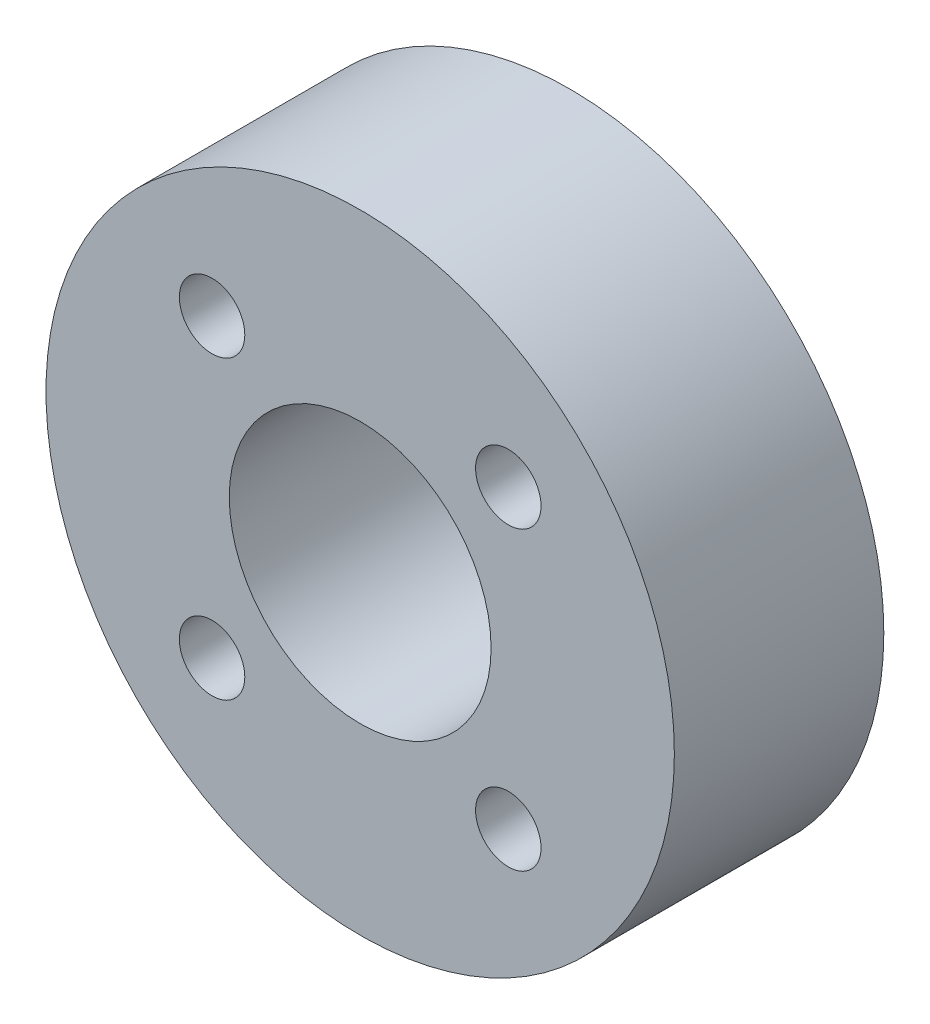
ISO-10303-21;
HEADER;
FILE_DESCRIPTION(('STEP AP214'),'2;1');
FILE_NAME('part.step','',(''),(''),'','','');
FILE_SCHEMA(('AUTOMOTIVE_DESIGN { 1 0 10303 214 1 1 1 1 }'));
ENDSEC;
DATA;
#1=APPLICATION_CONTEXT('core data for automotive mechanical design processes');
#2=APPLICATION_PROTOCOL_DEFINITION('international standard','automotive_design',2000,#1);
#3=PRODUCT_CONTEXT('',#1,'mechanical');
#4=PRODUCT('Part','Part','',(#3));
#5=PRODUCT_RELATED_PRODUCT_CATEGORY('part','',(#4));
#6=PRODUCT_DEFINITION_FORMATION('','',#4);
#7=PRODUCT_DEFINITION_CONTEXT('part definition',#1,'design');
#8=PRODUCT_DEFINITION('design','',#6,#7);
#9=PRODUCT_DEFINITION_SHAPE('','',#8);
#10=(LENGTH_UNIT() NAMED_UNIT(*) SI_UNIT(.MILLI.,.METRE.));
#11=(NAMED_UNIT(*) PLANE_ANGLE_UNIT() SI_UNIT($,.RADIAN.));
#12=(NAMED_UNIT(*) SI_UNIT($,.STERADIAN.) SOLID_ANGLE_UNIT());
#13=UNCERTAINTY_MEASURE_WITH_UNIT(LENGTH_MEASURE(1.E-05),#10,'distance_accuracy_value','');
#14=(GEOMETRIC_REPRESENTATION_CONTEXT(3) GLOBAL_UNCERTAINTY_ASSIGNED_CONTEXT((#13)) GLOBAL_UNIT_ASSIGNED_CONTEXT((#10,
#11,#12)) REPRESENTATION_CONTEXT('',''));
#15=CARTESIAN_POINT('',(0.,0.,0.));
#16=DIRECTION('',(0.,0.,1.));
#17=DIRECTION('',(1.,0.,0.));
#18=AXIS2_PLACEMENT_3D('',#15,#16,#17);
#19=CARTESIAN_POINT('',(0.,0.,8.));
#20=DIRECTION('',(0.,0.,1.));
#21=DIRECTION('',(1.,0.,0.));
#22=AXIS2_PLACEMENT_3D('',#19,#20,#21);
#23=PLANE('',#22);
#24=CARTESIAN_POINT('',(5.65685424949238,-5.65685424949238,8.));
#25=DIRECTION('',(0.,0.,1.));
#26=DIRECTION('',(1.,0.,0.));
#27=AXIS2_PLACEMENT_3D('',#24,#25,#26);
#28=CIRCLE('',#27,1.24999999999999);
#29=CARTESIAN_POINT('',(6.90685424949237,-5.65685424949238,8.));
#30=VERTEX_POINT('',#29);
#31=EDGE_CURVE('E83',#30,#30,#28,.T.);
#32=ORIENTED_EDGE('',*,*,#31,.F.);
#33=EDGE_LOOP('',(#32));
#34=FACE_BOUND('',#33,.T.);
#35=CARTESIAN_POINT('',(-5.65685424949238,-5.65685424949238,8.));
#36=DIRECTION('',(0.,0.,1.));
#37=DIRECTION('',(1.,0.,0.));
#38=AXIS2_PLACEMENT_3D('',#35,#36,#37);
#39=CIRCLE('',#38,1.24999999999999);
#40=CARTESIAN_POINT('',(-4.40685424949239,-5.65685424949238,8.));
#41=VERTEX_POINT('',#40);
#42=EDGE_CURVE('E76',#41,#41,#39,.T.);
#43=ORIENTED_EDGE('',*,*,#42,.F.);
#44=EDGE_LOOP('',(#43));
#45=FACE_BOUND('',#44,.T.);
#46=CARTESIAN_POINT('',(-5.65685424949238,5.65685424949238,8.));
#47=DIRECTION('',(0.,0.,1.));
#48=DIRECTION('',(1.,0.,0.));
#49=AXIS2_PLACEMENT_3D('',#46,#47,#48);
#50=CIRCLE('',#49,1.24999999999999);
#51=CARTESIAN_POINT('',(-4.40685424949239,5.65685424949238,8.));
#52=VERTEX_POINT('',#51);
#53=EDGE_CURVE('E75',#52,#52,#50,.T.);
#54=ORIENTED_EDGE('',*,*,#53,.F.);
#55=EDGE_LOOP('',(#54));
#56=FACE_BOUND('',#55,.T.);
#57=CARTESIAN_POINT('',(5.65685424949238,5.65685424949238,8.));
#58=DIRECTION('',(0.,0.,1.));
#59=DIRECTION('',(1.,0.,0.));
#60=AXIS2_PLACEMENT_3D('',#57,#58,#59);
#61=CIRCLE('',#60,1.24999999999999);
#62=CARTESIAN_POINT('',(6.90685424949237,5.65685424949238,8.));
#63=VERTEX_POINT('',#62);
#64=EDGE_CURVE('E67',#63,#63,#61,.T.);
#65=ORIENTED_EDGE('',*,*,#64,.F.);
#66=EDGE_LOOP('',(#65));
#67=FACE_BOUND('',#66,.T.);
#68=CARTESIAN_POINT('',(0.,0.,8.));
#69=DIRECTION('',(0.,0.,1.));
#70=DIRECTION('',(1.,0.,0.));
#71=AXIS2_PLACEMENT_3D('',#68,#69,#70);
#72=CIRCLE('',#71,12.);
#73=CARTESIAN_POINT('',(12.,0.,8.));
#74=VERTEX_POINT('',#73);
#75=EDGE_CURVE('E10',#74,#74,#72,.T.);
#76=ORIENTED_EDGE('',*,*,#75,.T.);
#77=EDGE_LOOP('',(#76));
#78=FACE_BOUND('',#77,.T.);
#79=CARTESIAN_POINT('',(0.,0.,8.));
#80=DIRECTION('',(0.,0.,1.));
#81=DIRECTION('',(1.,0.,0.));
#82=AXIS2_PLACEMENT_3D('',#79,#80,#81);
#83=CIRCLE('',#82,5.);
#84=CARTESIAN_POINT('',(5.,0.,8.));
#85=VERTEX_POINT('',#84);
#86=EDGE_CURVE('E57',#85,#85,#83,.T.);
#87=ORIENTED_EDGE('',*,*,#86,.F.);
#88=EDGE_LOOP('',(#87));
#89=FACE_BOUND('',#88,.T.);
#90=ADVANCED_FACE('F44',(#34,#45,#56,#67,#78,#89),#23,.T.);
#91=CARTESIAN_POINT('',(0.,0.,0.));
#92=DIRECTION('',(0.,0.,1.));
#93=DIRECTION('',(1.,0.,0.));
#94=AXIS2_PLACEMENT_3D('',#91,#92,#93);
#95=PLANE('',#94);
#96=CARTESIAN_POINT('',(5.65685424949238,-5.65685424949238,0.));
#97=DIRECTION('',(0.,0.,1.));
#98=DIRECTION('',(1.,0.,0.));
#99=AXIS2_PLACEMENT_3D('',#96,#97,#98);
#100=CIRCLE('',#99,1.24999999999999);
#101=CARTESIAN_POINT('',(6.90685424949237,-5.65685424949238,0.));
#102=VERTEX_POINT('',#101);
#103=EDGE_CURVE('E84',#102,#102,#100,.T.);
#104=ORIENTED_EDGE('',*,*,#103,.T.);
#105=EDGE_LOOP('',(#104));
#106=FACE_BOUND('',#105,.T.);
#107=CARTESIAN_POINT('',(-5.65685424949238,-5.65685424949238,0.));
#108=DIRECTION('',(0.,0.,1.));
#109=DIRECTION('',(1.,0.,0.));
#110=AXIS2_PLACEMENT_3D('',#107,#108,#109);
#111=CIRCLE('',#110,1.24999999999999);
#112=CARTESIAN_POINT('',(-4.4068542494924,-5.65685424949238,0.));
#113=VERTEX_POINT('',#112);
#114=EDGE_CURVE('E74',#113,#113,#111,.T.);
#115=ORIENTED_EDGE('',*,*,#114,.T.);
#116=EDGE_LOOP('',(#115));
#117=FACE_BOUND('',#116,.T.);
#118=CARTESIAN_POINT('',(-5.65685424949238,5.65685424949238,0.));
#119=DIRECTION('',(0.,0.,1.));
#120=DIRECTION('',(1.,0.,0.));
#121=AXIS2_PLACEMENT_3D('',#118,#119,#120);
#122=CIRCLE('',#121,1.24999999999999);
#123=CARTESIAN_POINT('',(-4.40685424949239,5.65685424949238,0.));
#124=VERTEX_POINT('',#123);
#125=EDGE_CURVE('E66',#124,#124,#122,.T.);
#126=ORIENTED_EDGE('',*,*,#125,.T.);
#127=EDGE_LOOP('',(#126));
#128=FACE_BOUND('',#127,.T.);
#129=CARTESIAN_POINT('',(5.65685424949238,5.65685424949238,0.));
#130=DIRECTION('',(0.,0.,1.));
#131=DIRECTION('',(1.,0.,0.));
#132=AXIS2_PLACEMENT_3D('',#129,#130,#131);
#133=CIRCLE('',#132,1.24999999999999);
#134=CARTESIAN_POINT('',(6.90685424949237,5.65685424949238,0.));
#135=VERTEX_POINT('',#134);
#136=EDGE_CURVE('E64',#135,#135,#133,.T.);
#137=ORIENTED_EDGE('',*,*,#136,.T.);
#138=EDGE_LOOP('',(#137));
#139=FACE_BOUND('',#138,.T.);
#140=CARTESIAN_POINT('',(0.,0.,0.));
#141=DIRECTION('',(0.,0.,1.));
#142=DIRECTION('',(1.,0.,0.));
#143=AXIS2_PLACEMENT_3D('',#140,#141,#142);
#144=CIRCLE('',#143,12.);
#145=CARTESIAN_POINT('',(12.,0.,0.));
#146=VERTEX_POINT('',#145);
#147=EDGE_CURVE('E47',#146,#146,#144,.T.);
#148=ORIENTED_EDGE('',*,*,#147,.F.);
#149=EDGE_LOOP('',(#148));
#150=FACE_BOUND('',#149,.T.);
#151=CARTESIAN_POINT('',(0.,0.,0.));
#152=DIRECTION('',(0.,0.,1.));
#153=DIRECTION('',(1.,0.,0.));
#154=AXIS2_PLACEMENT_3D('',#151,#152,#153);
#155=CIRCLE('',#154,5.);
#156=CARTESIAN_POINT('',(5.,0.,0.));
#157=VERTEX_POINT('',#156);
#158=EDGE_CURVE('E59',#157,#157,#155,.T.);
#159=ORIENTED_EDGE('',*,*,#158,.T.);
#160=EDGE_LOOP('',(#159));
#161=FACE_BOUND('',#160,.T.);
#162=ADVANCED_FACE('F95',(#106,#117,#128,#139,#150,#161),#95,.F.);
#163=CARTESIAN_POINT('',(0.,0.,8.));
#164=DIRECTION('',(0.,0.,-1.));
#165=DIRECTION('',(-1.,0.,0.));
#166=AXIS2_PLACEMENT_3D('',#163,#164,#165);
#167=CYLINDRICAL_SURFACE('',#166,12.);
#168=ORIENTED_EDGE('',*,*,#75,.F.);
#169=EDGE_LOOP('',(#168));
#170=FACE_BOUND('',#169,.T.);
#171=ORIENTED_EDGE('',*,*,#147,.T.);
#172=EDGE_LOOP('',(#171));
#173=FACE_BOUND('',#172,.T.);
#174=ADVANCED_FACE('F50',(#170,#173),#167,.T.);
#175=CARTESIAN_POINT('',(0.,0.,8.));
#176=DIRECTION('',(0.,0.,-1.));
#177=DIRECTION('',(-1.,0.,0.));
#178=AXIS2_PLACEMENT_3D('',#175,#176,#177);
#179=CYLINDRICAL_SURFACE('',#178,5.);
#180=ORIENTED_EDGE('',*,*,#86,.T.);
#181=EDGE_LOOP('',(#180));
#182=FACE_BOUND('',#181,.T.);
#183=ORIENTED_EDGE('',*,*,#158,.F.);
#184=EDGE_LOOP('',(#183));
#185=FACE_BOUND('',#184,.T.);
#186=ADVANCED_FACE('F105',(#182,#185),#179,.F.);
#187=CARTESIAN_POINT('',(5.65685424949238,5.65685424949238,8.));
#188=DIRECTION('',(0.,0.,1.));
#189=DIRECTION('',(1.,0.,0.));
#190=AXIS2_PLACEMENT_3D('',#187,#188,#189);
#191=CYLINDRICAL_SURFACE('',#190,1.24999999999999);
#192=ORIENTED_EDGE('',*,*,#136,.F.);
#193=EDGE_LOOP('',(#192));
#194=FACE_BOUND('',#193,.T.);
#195=ORIENTED_EDGE('',*,*,#64,.T.);
#196=EDGE_LOOP('',(#195));
#197=FACE_BOUND('',#196,.T.);
#198=ADVANCED_FACE('F102',(#194,#197),#191,.F.);
#199=CARTESIAN_POINT('',(-5.65685424949238,5.65685424949238,8.));
#200=DIRECTION('',(0.,0.,1.));
#201=DIRECTION('',(1.,0.,0.));
#202=AXIS2_PLACEMENT_3D('',#199,#200,#201);
#203=CYLINDRICAL_SURFACE('',#202,1.24999999999999);
#204=ORIENTED_EDGE('',*,*,#125,.F.);
#205=EDGE_LOOP('',(#204));
#206=FACE_BOUND('',#205,.T.);
#207=ORIENTED_EDGE('',*,*,#53,.T.);
#208=EDGE_LOOP('',(#207));
#209=FACE_BOUND('',#208,.T.);
#210=ADVANCED_FACE('F118',(#206,#209),#203,.F.);
#211=CARTESIAN_POINT('',(-5.65685424949238,-5.65685424949238,8.));
#212=DIRECTION('',(0.,0.,1.));
#213=DIRECTION('',(1.,0.,0.));
#214=AXIS2_PLACEMENT_3D('',#211,#212,#213);
#215=CYLINDRICAL_SURFACE('',#214,1.24999999999999);
#216=ORIENTED_EDGE('',*,*,#114,.F.);
#217=EDGE_LOOP('',(#216));
#218=FACE_BOUND('',#217,.T.);
#219=ORIENTED_EDGE('',*,*,#42,.T.);
#220=EDGE_LOOP('',(#219));
#221=FACE_BOUND('',#220,.T.);
#222=ADVANCED_FACE('F124',(#218,#221),#215,.F.);
#223=CARTESIAN_POINT('',(5.65685424949238,-5.65685424949238,8.));
#224=DIRECTION('',(0.,0.,1.));
#225=DIRECTION('',(1.,0.,0.));
#226=AXIS2_PLACEMENT_3D('',#223,#224,#225);
#227=CYLINDRICAL_SURFACE('',#226,1.24999999999999);
#228=ORIENTED_EDGE('',*,*,#103,.F.);
#229=EDGE_LOOP('',(#228));
#230=FACE_BOUND('',#229,.T.);
#231=ORIENTED_EDGE('',*,*,#31,.T.);
#232=EDGE_LOOP('',(#231));
#233=FACE_BOUND('',#232,.T.);
#234=ADVANCED_FACE('F90',(#230,#233),#227,.F.);
#235=CLOSED_SHELL('',(#90,#162,#174,#186,#198,#210,#222,#234));
#236=MANIFOLD_SOLID_BREP('B2',#235);
#237=ADVANCED_BREP_SHAPE_REPRESENTATION('',(#18,#236),#14);
#238=SHAPE_DEFINITION_REPRESENTATION(#9,#237);
ENDSEC;
END-ISO-10303-21;
